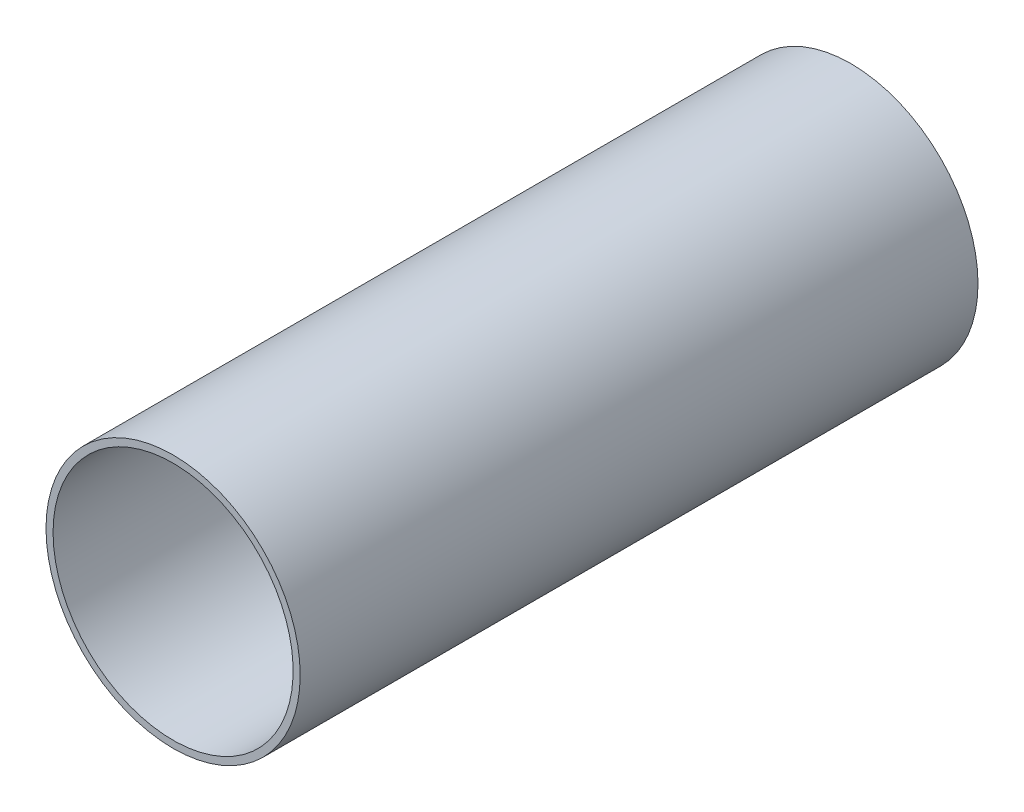
ISO-10303-21;
HEADER;
FILE_DESCRIPTION(('STEP AP214'),'2;1');
FILE_NAME('part.step','',(''),(''),'','','');
FILE_SCHEMA(('AUTOMOTIVE_DESIGN { 1 0 10303 214 1 1 1 1 }'));
ENDSEC;
DATA;
#1=APPLICATION_CONTEXT('core data for automotive mechanical design processes');
#2=APPLICATION_PROTOCOL_DEFINITION('international standard','automotive_design',2000,#1);
#3=PRODUCT_CONTEXT('',#1,'mechanical');
#4=PRODUCT('Part','Part','',(#3));
#5=PRODUCT_RELATED_PRODUCT_CATEGORY('part','',(#4));
#6=PRODUCT_DEFINITION_FORMATION('','',#4);
#7=PRODUCT_DEFINITION_CONTEXT('part definition',#1,'design');
#8=PRODUCT_DEFINITION('design','',#6,#7);
#9=PRODUCT_DEFINITION_SHAPE('','',#8);
#10=(LENGTH_UNIT() NAMED_UNIT(*) SI_UNIT(.MILLI.,.METRE.));
#11=(NAMED_UNIT(*) PLANE_ANGLE_UNIT() SI_UNIT($,.RADIAN.));
#12=(NAMED_UNIT(*) SI_UNIT($,.STERADIAN.) SOLID_ANGLE_UNIT());
#13=UNCERTAINTY_MEASURE_WITH_UNIT(LENGTH_MEASURE(1.E-05),#10,'distance_accuracy_value','');
#14=(GEOMETRIC_REPRESENTATION_CONTEXT(3) GLOBAL_UNCERTAINTY_ASSIGNED_CONTEXT((#13)) GLOBAL_UNIT_ASSIGNED_CONTEXT((#10,
#11,#12)) REPRESENTATION_CONTEXT('',''));
#15=CARTESIAN_POINT('',(0.,0.,0.));
#16=DIRECTION('',(0.,0.,1.));
#17=DIRECTION('',(1.,0.,0.));
#18=AXIS2_PLACEMENT_3D('',#15,#16,#17);
#19=CARTESIAN_POINT('',(0.,0.,152.4));
#20=DIRECTION('',(0.,0.,1.));
#21=DIRECTION('',(1.,0.,0.));
#22=AXIS2_PLACEMENT_3D('',#19,#20,#21);
#23=PLANE('',#22);
#24=CARTESIAN_POINT('',(0.,0.,152.4));
#25=DIRECTION('',(0.,0.,1.));
#26=DIRECTION('',(1.,0.,0.));
#27=AXIS2_PLACEMENT_3D('',#24,#25,#26);
#28=CIRCLE('',#27,57.15);
#29=CARTESIAN_POINT('',(-57.15,0.,152.4));
#30=VERTEX_POINT('',#29);
#31=EDGE_CURVE('E10',#30,#30,#28,.T.);
#32=ORIENTED_EDGE('',*,*,#31,.T.);
#33=EDGE_LOOP('',(#32));
#34=FACE_BOUND('',#33,.T.);
#35=CARTESIAN_POINT('',(0.,0.,152.4));
#36=DIRECTION('',(0.,0.,1.));
#37=DIRECTION('',(1.,0.,0.));
#38=AXIS2_PLACEMENT_3D('',#35,#36,#37);
#39=CIRCLE('',#38,53.975);
#40=CARTESIAN_POINT('',(-53.975,0.,152.4));
#41=VERTEX_POINT('',#40);
#42=EDGE_CURVE('E49',#41,#41,#39,.T.);
#43=ORIENTED_EDGE('',*,*,#42,.F.);
#44=EDGE_LOOP('',(#43));
#45=FACE_BOUND('',#44,.T.);
#46=ADVANCED_FACE('F41',(#34,#45),#23,.T.);
#47=CARTESIAN_POINT('',(0.,0.,152.4));
#48=DIRECTION('',(0.,0.,-1.));
#49=DIRECTION('',(-1.,0.,0.));
#50=AXIS2_PLACEMENT_3D('',#47,#48,#49);
#51=CYLINDRICAL_SURFACE('',#50,57.15);
#52=CARTESIAN_POINT('',(0.,0.,-152.4));
#53=DIRECTION('',(0.,0.,1.));
#54=DIRECTION('',(1.,0.,0.));
#55=AXIS2_PLACEMENT_3D('',#52,#53,#54);
#56=CIRCLE('',#55,57.15);
#57=CARTESIAN_POINT('',(-57.15,0.,-152.4));
#58=VERTEX_POINT('',#57);
#59=EDGE_CURVE('E54',#58,#58,#56,.T.);
#60=CARTESIAN_POINT('',(-57.15,0.,152.4));
#61=CARTESIAN_POINT('',(-57.15,0.,149.225));
#62=CARTESIAN_POINT('',(-57.15,0.,146.05));
#63=CARTESIAN_POINT('',(-57.15,0.,139.7));
#64=CARTESIAN_POINT('',(-57.15,0.,136.525));
#65=CARTESIAN_POINT('',(-57.15,0.,130.175));
#66=CARTESIAN_POINT('',(-57.15,0.,127.));
#67=CARTESIAN_POINT('',(-57.15,0.,120.65));
#68=CARTESIAN_POINT('',(-57.15,0.,117.475));
#69=CARTESIAN_POINT('',(-57.15,0.,111.125));
#70=CARTESIAN_POINT('',(-57.15,0.,107.95));
#71=CARTESIAN_POINT('',(-57.15,0.,101.6));
#72=CARTESIAN_POINT('',(-57.15,0.,98.425));
#73=CARTESIAN_POINT('',(-57.15,0.,92.075));
#74=CARTESIAN_POINT('',(-57.15,0.,88.9));
#75=CARTESIAN_POINT('',(-57.15,0.,82.55));
#76=CARTESIAN_POINT('',(-57.15,0.,79.375));
#77=CARTESIAN_POINT('',(-57.15,0.,73.025));
#78=CARTESIAN_POINT('',(-57.15,0.,69.85));
#79=CARTESIAN_POINT('',(-57.15,0.,63.5));
#80=CARTESIAN_POINT('',(-57.15,0.,60.325));
#81=CARTESIAN_POINT('',(-57.15,0.,53.975));
#82=CARTESIAN_POINT('',(-57.15,0.,50.8));
#83=CARTESIAN_POINT('',(-57.15,0.,44.45));
#84=CARTESIAN_POINT('',(-57.15,0.,41.275));
#85=CARTESIAN_POINT('',(-57.15,0.,34.925));
#86=CARTESIAN_POINT('',(-57.15,0.,31.75));
#87=CARTESIAN_POINT('',(-57.15,0.,25.4));
#88=CARTESIAN_POINT('',(-57.15,0.,22.225));
#89=CARTESIAN_POINT('',(-57.15,0.,15.875));
#90=CARTESIAN_POINT('',(-57.15,0.,12.7));
#91=CARTESIAN_POINT('',(-57.15,0.,6.35));
#92=CARTESIAN_POINT('',(-57.15,0.,3.175));
#93=CARTESIAN_POINT('',(-57.15,0.,-3.175));
#94=CARTESIAN_POINT('',(-57.15,0.,-6.35));
#95=CARTESIAN_POINT('',(-57.15,0.,-12.7));
#96=CARTESIAN_POINT('',(-57.15,0.,-15.875));
#97=CARTESIAN_POINT('',(-57.15,0.,-22.225));
#98=CARTESIAN_POINT('',(-57.15,0.,-25.4));
#99=CARTESIAN_POINT('',(-57.15,0.,-31.75));
#100=CARTESIAN_POINT('',(-57.15,0.,-34.925));
#101=CARTESIAN_POINT('',(-57.15,0.,-41.275));
#102=CARTESIAN_POINT('',(-57.15,0.,-44.45));
#103=CARTESIAN_POINT('',(-57.15,0.,-50.8));
#104=CARTESIAN_POINT('',(-57.15,0.,-53.975));
#105=CARTESIAN_POINT('',(-57.15,0.,-60.325));
#106=CARTESIAN_POINT('',(-57.15,0.,-63.5));
#107=CARTESIAN_POINT('',(-57.15,0.,-69.85));
#108=CARTESIAN_POINT('',(-57.15,0.,-73.025));
#109=CARTESIAN_POINT('',(-57.15,0.,-79.375));
#110=CARTESIAN_POINT('',(-57.15,0.,-82.55));
#111=CARTESIAN_POINT('',(-57.15,0.,-88.9));
#112=CARTESIAN_POINT('',(-57.15,0.,-92.075));
#113=CARTESIAN_POINT('',(-57.15,0.,-98.425));
#114=CARTESIAN_POINT('',(-57.15,0.,-101.6));
#115=CARTESIAN_POINT('',(-57.15,0.,-107.95));
#116=CARTESIAN_POINT('',(-57.15,0.,-111.125));
#117=CARTESIAN_POINT('',(-57.15,0.,-117.475));
#118=CARTESIAN_POINT('',(-57.15,0.,-120.65));
#119=CARTESIAN_POINT('',(-57.15,0.,-127.));
#120=CARTESIAN_POINT('',(-57.15,0.,-130.175));
#121=CARTESIAN_POINT('',(-57.15,0.,-136.525));
#122=CARTESIAN_POINT('',(-57.15,0.,-139.7));
#123=CARTESIAN_POINT('',(-57.15,0.,-146.05));
#124=CARTESIAN_POINT('',(-57.15,0.,-149.225));
#125=CARTESIAN_POINT('',(-57.15,0.,-152.4));
#126=B_SPLINE_CURVE_WITH_KNOTS('',3,(#60,#61,#62,#63,#64,#65,#66,#67,#68,#69,#70,#71,#72,#73,
#74,#75,#76,#77,#78,#79,#80,#81,#82,#83,#84,#85,#86,#87,#88,#89,#90,#91,#92,#93,#94,#95,#96,#97,
#98,#99,#100,#101,#102,#103,#104,#105,#106,#107,#108,#109,#110,#111,#112,#113,#114,#115,#116,
#117,#118,#119,#120,#121,#122,#123,#124,#125),.UNSPECIFIED.,.F.,.F.,(4,2,2,2,2,2,2,2,2,2,2,2,2,
2,2,2,2,2,2,2,2,2,2,2,2,2,2,2,2,2,2,2,4),(0.,9.52500000000001,19.05,28.575,38.1,47.625,57.15,
66.675,76.2,85.725,95.25,104.775,114.3,123.825,133.35,142.875,152.4,161.925,171.45,180.975,
190.5,200.025,209.55,219.075,228.6,238.125,247.65,257.175,266.7,276.225,285.75,295.275,304.8),.UNSPECIFIED.);
#127=EDGE_CURVE('BSEAM43',#30,#58,#126,.T.);
#128=ORIENTED_EDGE('',*,*,#31,.F.);
#129=ORIENTED_EDGE('',*,*,#59,.T.);
#130=ORIENTED_EDGE('',*,*,#127,.T.);
#131=ORIENTED_EDGE('',*,*,#127,.F.);
#132=EDGE_LOOP('',(#128,#130,#129,#131));
#133=FACE_BOUND('',#132,.T.);
#134=ADVANCED_FACE('F43',(#133),#51,.T.);
#135=CARTESIAN_POINT('',(0.,0.,152.4));
#136=DIRECTION('',(0.,0.,-1.));
#137=DIRECTION('',(-1.,0.,0.));
#138=AXIS2_PLACEMENT_3D('',#135,#136,#137);
#139=CYLINDRICAL_SURFACE('',#138,53.975);
#140=CARTESIAN_POINT('',(0.,0.,-152.4));
#141=DIRECTION('',(0.,0.,1.));
#142=DIRECTION('',(1.,0.,0.));
#143=AXIS2_PLACEMENT_3D('',#140,#141,#142);
#144=CIRCLE('',#143,53.975);
#145=CARTESIAN_POINT('',(-53.975,0.,-152.4));
#146=VERTEX_POINT('',#145);
#147=EDGE_CURVE('E59',#146,#146,#144,.T.);
#148=CARTESIAN_POINT('',(-53.975,0.,152.4));
#149=CARTESIAN_POINT('',(-53.975,0.,149.225));
#150=CARTESIAN_POINT('',(-53.975,0.,146.05));
#151=CARTESIAN_POINT('',(-53.975,0.,139.7));
#152=CARTESIAN_POINT('',(-53.975,0.,136.525));
#153=CARTESIAN_POINT('',(-53.975,0.,130.175));
#154=CARTESIAN_POINT('',(-53.975,0.,127.));
#155=CARTESIAN_POINT('',(-53.975,0.,120.65));
#156=CARTESIAN_POINT('',(-53.975,0.,117.475));
#157=CARTESIAN_POINT('',(-53.975,0.,111.125));
#158=CARTESIAN_POINT('',(-53.975,0.,107.95));
#159=CARTESIAN_POINT('',(-53.975,0.,101.6));
#160=CARTESIAN_POINT('',(-53.975,0.,98.425));
#161=CARTESIAN_POINT('',(-53.975,0.,92.075));
#162=CARTESIAN_POINT('',(-53.975,0.,88.9));
#163=CARTESIAN_POINT('',(-53.975,0.,82.55));
#164=CARTESIAN_POINT('',(-53.975,0.,79.375));
#165=CARTESIAN_POINT('',(-53.975,0.,73.025));
#166=CARTESIAN_POINT('',(-53.975,0.,69.85));
#167=CARTESIAN_POINT('',(-53.975,0.,63.5));
#168=CARTESIAN_POINT('',(-53.975,0.,60.325));
#169=CARTESIAN_POINT('',(-53.975,0.,53.975));
#170=CARTESIAN_POINT('',(-53.975,0.,50.8));
#171=CARTESIAN_POINT('',(-53.975,0.,44.45));
#172=CARTESIAN_POINT('',(-53.975,0.,41.275));
#173=CARTESIAN_POINT('',(-53.975,0.,34.925));
#174=CARTESIAN_POINT('',(-53.975,0.,31.75));
#175=CARTESIAN_POINT('',(-53.975,0.,25.4));
#176=CARTESIAN_POINT('',(-53.975,0.,22.225));
#177=CARTESIAN_POINT('',(-53.975,0.,15.875));
#178=CARTESIAN_POINT('',(-53.975,0.,12.7));
#179=CARTESIAN_POINT('',(-53.975,0.,6.34999999999998));
#180=CARTESIAN_POINT('',(-53.975,0.,3.17499999999997));
#181=CARTESIAN_POINT('',(-53.975,0.,-3.17500000000003));
#182=CARTESIAN_POINT('',(-53.975,0.,-6.35000000000003));
#183=CARTESIAN_POINT('',(-53.975,0.,-12.7));
#184=CARTESIAN_POINT('',(-53.975,0.,-15.875));
#185=CARTESIAN_POINT('',(-53.975,0.,-22.225));
#186=CARTESIAN_POINT('',(-53.975,0.,-25.4));
#187=CARTESIAN_POINT('',(-53.975,0.,-31.75));
#188=CARTESIAN_POINT('',(-53.975,0.,-34.925));
#189=CARTESIAN_POINT('',(-53.975,0.,-41.275));
#190=CARTESIAN_POINT('',(-53.975,0.,-44.45));
#191=CARTESIAN_POINT('',(-53.975,0.,-50.8));
#192=CARTESIAN_POINT('',(-53.975,0.,-53.975));
#193=CARTESIAN_POINT('',(-53.975,0.,-60.325));
#194=CARTESIAN_POINT('',(-53.975,0.,-63.5));
#195=CARTESIAN_POINT('',(-53.975,0.,-69.85));
#196=CARTESIAN_POINT('',(-53.975,0.,-73.025));
#197=CARTESIAN_POINT('',(-53.975,0.,-79.375));
#198=CARTESIAN_POINT('',(-53.975,0.,-82.5500000000001));
#199=CARTESIAN_POINT('',(-53.975,0.,-88.9));
#200=CARTESIAN_POINT('',(-53.975,0.,-92.0750000000001));
#201=CARTESIAN_POINT('',(-53.975,0.,-98.425));
#202=CARTESIAN_POINT('',(-53.975,0.,-101.6));
#203=CARTESIAN_POINT('',(-53.975,0.,-107.95));
#204=CARTESIAN_POINT('',(-53.975,0.,-111.125));
#205=CARTESIAN_POINT('',(-53.975,0.,-117.475));
#206=CARTESIAN_POINT('',(-53.975,0.,-120.65));
#207=CARTESIAN_POINT('',(-53.975,0.,-127.));
#208=CARTESIAN_POINT('',(-53.975,0.,-130.175));
#209=CARTESIAN_POINT('',(-53.975,0.,-136.525));
#210=CARTESIAN_POINT('',(-53.975,0.,-139.7));
#211=CARTESIAN_POINT('',(-53.975,0.,-146.05));
#212=CARTESIAN_POINT('',(-53.975,0.,-149.225));
#213=CARTESIAN_POINT('',(-53.975,0.,-152.4));
#214=B_SPLINE_CURVE_WITH_KNOTS('',3,(#148,#149,#150,#151,#152,#153,#154,#155,#156,#157,#158,
#159,#160,#161,#162,#163,#164,#165,#166,#167,#168,#169,#170,#171,#172,#173,#174,#175,#176,#177,
#178,#179,#180,#181,#182,#183,#184,#185,#186,#187,#188,#189,#190,#191,#192,#193,#194,#195,#196,
#197,#198,#199,#200,#201,#202,#203,#204,#205,#206,#207,#208,#209,#210,#211,#212,#213),
.UNSPECIFIED.,.F.,.F.,(4,2,2,2,2,2,2,2,2,2,2,2,2,2,2,2,2,2,2,2,2,2,2,2,2,2,2,2,2,2,2,2,4),(0.,
9.52499999999998,19.05,28.575,38.1,47.625,57.15,66.675,76.2,85.725,95.25,104.775,114.3,123.825,
133.35,142.875,152.4,161.925,171.45,180.975,190.5,200.025,209.55,219.075,228.6,238.125,247.65,
257.175,266.7,276.225,285.75,295.275,304.8),.UNSPECIFIED.);
#215=EDGE_CURVE('BSEAM69',#41,#146,#214,.T.);
#216=ORIENTED_EDGE('',*,*,#42,.T.);
#217=ORIENTED_EDGE('',*,*,#147,.F.);
#218=ORIENTED_EDGE('',*,*,#215,.T.);
#219=ORIENTED_EDGE('',*,*,#215,.F.);
#220=EDGE_LOOP('',(#216,#218,#217,#219));
#221=FACE_BOUND('',#220,.T.);
#222=ADVANCED_FACE('F69',(#221),#139,.F.);
#223=CARTESIAN_POINT('',(0.,0.,-152.4));
#224=DIRECTION('',(0.,0.,1.));
#225=DIRECTION('',(1.,0.,0.));
#226=AXIS2_PLACEMENT_3D('',#223,#224,#225);
#227=PLANE('',#226);
#228=ORIENTED_EDGE('',*,*,#147,.T.);
#229=EDGE_LOOP('',(#228));
#230=FACE_BOUND('',#229,.T.);
#231=ORIENTED_EDGE('',*,*,#59,.F.);
#232=EDGE_LOOP('',(#231));
#233=FACE_BOUND('',#232,.T.);
#234=ADVANCED_FACE('F66',(#230,#233),#227,.F.);
#235=CLOSED_SHELL('',(#46,#134,#222,#234));
#236=MANIFOLD_SOLID_BREP('B2',#235);
#237=ADVANCED_BREP_SHAPE_REPRESENTATION('',(#18,#236),#14);
#238=SHAPE_DEFINITION_REPRESENTATION(#9,#237);
ENDSEC;
END-ISO-10303-21;
